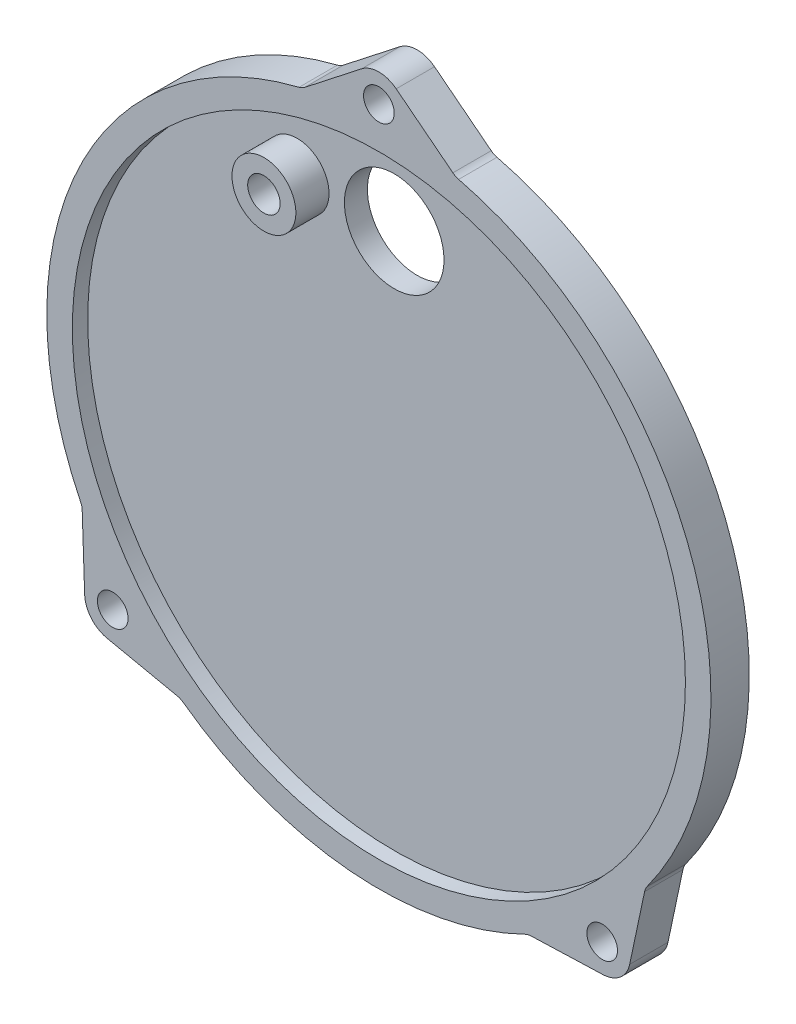
ISO-10303-21;
HEADER;
FILE_DESCRIPTION(('STEP AP214'),'2;1');
FILE_NAME('part.step','',(''),(''),'','','');
FILE_SCHEMA(('AUTOMOTIVE_DESIGN { 1 0 10303 214 1 1 1 1 }'));
ENDSEC;
DATA;
#1=APPLICATION_CONTEXT('core data for automotive mechanical design processes');
#2=APPLICATION_PROTOCOL_DEFINITION('international standard','automotive_design',2000,#1);
#3=PRODUCT_CONTEXT('',#1,'mechanical');
#4=PRODUCT('Part','Part','',(#3));
#5=PRODUCT_RELATED_PRODUCT_CATEGORY('part','',(#4));
#6=PRODUCT_DEFINITION_FORMATION('','',#4);
#7=PRODUCT_DEFINITION_CONTEXT('part definition',#1,'design');
#8=PRODUCT_DEFINITION('design','',#6,#7);
#9=PRODUCT_DEFINITION_SHAPE('','',#8);
#10=(LENGTH_UNIT() NAMED_UNIT(*) SI_UNIT(.MILLI.,.METRE.));
#11=(NAMED_UNIT(*) PLANE_ANGLE_UNIT() SI_UNIT($,.RADIAN.));
#12=(NAMED_UNIT(*) SI_UNIT($,.STERADIAN.) SOLID_ANGLE_UNIT());
#13=UNCERTAINTY_MEASURE_WITH_UNIT(LENGTH_MEASURE(1.E-05),#10,'distance_accuracy_value','');
#14=(GEOMETRIC_REPRESENTATION_CONTEXT(3) GLOBAL_UNCERTAINTY_ASSIGNED_CONTEXT((#13)) GLOBAL_UNIT_ASSIGNED_CONTEXT((#10,
#11,#12)) REPRESENTATION_CONTEXT('',''));
#15=CARTESIAN_POINT('',(0.,0.,0.));
#16=DIRECTION('',(0.,0.,1.));
#17=DIRECTION('',(1.,0.,0.));
#18=AXIS2_PLACEMENT_3D('',#15,#16,#17);
#19=CARTESIAN_POINT('',(0.,0.,4.5));
#20=DIRECTION('',(0.,0.,1.));
#21=DIRECTION('',(1.,0.,0.));
#22=AXIS2_PLACEMENT_3D('',#19,#20,#21);
#23=PLANE('',#22);
#24=CARTESIAN_POINT('',(0.,0.,4.5));
#25=DIRECTION('',(0.,0.,1.));
#26=DIRECTION('',(1.,0.,0.));
#27=AXIS2_PLACEMENT_3D('',#24,#25,#26);
#28=CIRCLE('',#27,60.);
#29=CARTESIAN_POINT('',(60.,0.,4.5));
#30=VERTEX_POINT('',#29);
#31=EDGE_CURVE('E192',#30,#30,#28,.F.);
#32=ORIENTED_EDGE('',*,*,#31,.F.);
#33=EDGE_LOOP('',(#32));
#34=FACE_BOUND('',#33,.T.);
#35=CARTESIAN_POINT('',(0.,45.,4.5));
#36=DIRECTION('',(0.,0.,1.));
#37=DIRECTION('',(1.,0.,0.));
#38=AXIS2_PLACEMENT_3D('',#35,#36,#37);
#39=CIRCLE('',#38,9.75);
#40=CARTESIAN_POINT('',(9.75,45.,4.5));
#41=VERTEX_POINT('',#40);
#42=EDGE_CURVE('E185',#41,#41,#39,.T.);
#43=ORIENTED_EDGE('',*,*,#42,.F.);
#44=EDGE_LOOP('',(#43));
#45=FACE_BOUND('',#44,.T.);
#46=CARTESIAN_POINT('',(-19.,45.,4.5));
#47=DIRECTION('',(0.,0.,1.));
#48=DIRECTION('',(1.,0.,0.));
#49=AXIS2_PLACEMENT_3D('',#46,#47,#48);
#50=CIRCLE('',#49,6.25);
#51=CARTESIAN_POINT('',(-25.25,45.,4.5));
#52=VERTEX_POINT('',#51);
#53=EDGE_CURVE('E645',#52,#52,#50,.T.);
#54=ORIENTED_EDGE('',*,*,#53,.F.);
#55=EDGE_LOOP('',(#54));
#56=FACE_BOUND('',#55,.T.);
#57=ADVANCED_FACE('F32',(#34,#45,#56),#23,.T.);
#58=CARTESIAN_POINT('',(0.,0.,4.5));
#59=DIRECTION('',(0.,0.,-1.));
#60=DIRECTION('',(-1.,0.,0.));
#61=AXIS2_PLACEMENT_3D('',#58,#59,#60);
#62=CYLINDRICAL_SURFACE('',#61,65.);
#63=CARTESIAN_POINT('',(0.,0.,0.));
#64=DIRECTION('',(0.,0.,1.));
#65=DIRECTION('',(1.,0.,0.));
#66=AXIS2_PLACEMENT_3D('',#63,#64,#65);
#67=CIRCLE('',#66,65.);
#68=CARTESIAN_POINT('',(-15.6168346836361,63.0960733680312,0.));
#69=VERTEX_POINT('',#68);
#70=CARTESIAN_POINT('',(-58.372704223372,-28.5941847523361,0.));
#71=VERTEX_POINT('',#70);
#72=EDGE_CURVE('E196',#69,#71,#67,.T.);
#73=ORIENTED_EDGE('',*,*,#72,.T.);
#74=DIRECTION('',(0.,0.,-1.));
#75=VECTOR('',#74,1.);
#76=CARTESIAN_POINT('',(-58.372704223372,-28.5941847523361,4.5));
#77=LINE('',#76,#75);
#78=CARTESIAN_POINT('',(-58.372704223372,-28.5941847523361,7.5));
#79=VERTEX_POINT('',#78);
#80=EDGE_CURVE('E228',#71,#79,#77,.F.);
#81=ORIENTED_EDGE('',*,*,#80,.T.);
#82=CARTESIAN_POINT('',(0.,0.,7.5));
#83=DIRECTION('',(0.,0.,1.));
#84=DIRECTION('',(1.,0.,0.));
#85=AXIS2_PLACEMENT_3D('',#82,#83,#84);
#86=CIRCLE('',#85,65.);
#87=CARTESIAN_POINT('',(-15.6168346836361,63.0960733680312,7.5));
#88=VERTEX_POINT('',#87);
#89=EDGE_CURVE('E166',#88,#79,#86,.T.);
#90=ORIENTED_EDGE('',*,*,#89,.F.);
#91=DIRECTION('',(0.,0.,-1.));
#92=VECTOR('',#91,1.);
#93=CARTESIAN_POINT('',(-15.6168346836361,63.0960733680312,4.5));
#94=LINE('',#93,#92);
#95=EDGE_CURVE('E225',#88,#69,#94,.T.);
#96=ORIENTED_EDGE('',*,*,#95,.T.);
#97=EDGE_LOOP('',(#73,#81,#90,#96));
#98=FACE_BOUND('',#97,.T.);
#99=ADVANCED_FACE('F363',(#98),#62,.T.);
#100=CARTESIAN_POINT('',(-38.2960885490436,-52.5205636093503,0.));
#101=VERTEX_POINT('',#100);
#102=CARTESIAN_POINT('',(28.5941847523363,-58.3727042233719,0.));
#103=VERTEX_POINT('',#102);
#104=EDGE_CURVE('E205',#101,#103,#67,.T.);
#105=ORIENTED_EDGE('',*,*,#104,.T.);
#106=DIRECTION('',(0.,0.,-1.));
#107=VECTOR('',#106,1.);
#108=CARTESIAN_POINT('',(28.5941847523363,-58.3727042233719,4.5));
#109=LINE('',#108,#107);
#110=CARTESIAN_POINT('',(28.5941847523363,-58.3727042233719,7.5));
#111=VERTEX_POINT('',#110);
#112=EDGE_CURVE('E218',#103,#111,#109,.F.);
#113=ORIENTED_EDGE('',*,*,#112,.T.);
#114=CARTESIAN_POINT('',(0.,0.,7.5));
#115=DIRECTION('',(0.,0.,1.));
#116=DIRECTION('',(1.,0.,0.));
#117=AXIS2_PLACEMENT_3D('',#114,#115,#116);
#118=CIRCLE('',#117,65.);
#119=CARTESIAN_POINT('',(-38.2960885490436,-52.5205636093503,7.5));
#120=VERTEX_POINT('',#119);
#121=EDGE_CURVE('E320',#120,#111,#118,.T.);
#122=ORIENTED_EDGE('',*,*,#121,.F.);
#123=DIRECTION('',(0.,0.,-1.));
#124=VECTOR('',#123,1.);
#125=CARTESIAN_POINT('',(-38.2960885490436,-52.5205636093503,4.5));
#126=LINE('',#125,#124);
#127=EDGE_CURVE('E215',#120,#101,#126,.T.);
#128=ORIENTED_EDGE('',*,*,#127,.T.);
#129=EDGE_LOOP('',(#105,#113,#122,#128));
#130=FACE_BOUND('',#129,.T.);
#131=ADVANCED_FACE('F317',(#130),#62,.T.);
#132=CARTESIAN_POINT('',(0.,0.,7.5));
#133=DIRECTION('',(0.,0.,1.));
#134=DIRECTION('',(1.,0.,0.));
#135=AXIS2_PLACEMENT_3D('',#132,#133,#134);
#136=CIRCLE('',#135,65.);
#137=CARTESIAN_POINT('',(52.5205636093505,-38.2960885490434,7.5));
#138=VERTEX_POINT('',#137);
#139=CARTESIAN_POINT('',(15.6168346836361,63.0960733680312,7.5));
#140=VERTEX_POINT('',#139);
#141=EDGE_CURVE('E265',#138,#140,#136,.T.);
#142=ORIENTED_EDGE('',*,*,#141,.F.);
#143=DIRECTION('',(0.,0.,-1.));
#144=VECTOR('',#143,1.);
#145=CARTESIAN_POINT('',(52.5205636093505,-38.2960885490434,4.5));
#146=LINE('',#145,#144);
#147=CARTESIAN_POINT('',(52.5205636093505,-38.2960885490434,0.));
#148=VERTEX_POINT('',#147);
#149=EDGE_CURVE('E207',#138,#148,#146,.T.);
#150=ORIENTED_EDGE('',*,*,#149,.T.);
#151=CARTESIAN_POINT('',(15.6168346836361,63.0960733680312,0.));
#152=VERTEX_POINT('',#151);
#153=EDGE_CURVE('E201',#148,#152,#67,.T.);
#154=ORIENTED_EDGE('',*,*,#153,.T.);
#155=DIRECTION('',(0.,0.,-1.));
#156=VECTOR('',#155,1.);
#157=CARTESIAN_POINT('',(15.6168346836361,63.0960733680312,4.5));
#158=LINE('',#157,#156);
#159=EDGE_CURVE('E195',#152,#140,#158,.F.);
#160=ORIENTED_EDGE('',*,*,#159,.T.);
#161=EDGE_LOOP('',(#142,#150,#154,#160));
#162=FACE_BOUND('',#161,.T.);
#163=ADVANCED_FACE('F260',(#162),#62,.T.);
#164=CARTESIAN_POINT('',(0.,0.,0.));
#165=DIRECTION('',(0.,0.,1.));
#166=DIRECTION('',(1.,0.,0.));
#167=AXIS2_PLACEMENT_3D('',#164,#165,#166);
#168=PLANE('',#167);
#169=CARTESIAN_POINT('',(0.,68.,0.));
#170=DIRECTION('',(0.,0.,1.));
#171=DIRECTION('',(1.,0.,0.));
#172=AXIS2_PLACEMENT_3D('',#169,#170,#171);
#173=CIRCLE('',#172,3.);
#174=CARTESIAN_POINT('',(3.,68.,0.));
#175=VERTEX_POINT('',#174);
#176=EDGE_CURVE('E388',#175,#175,#173,.T.);
#177=ORIENTED_EDGE('',*,*,#176,.T.);
#178=EDGE_LOOP('',(#177));
#179=FACE_BOUND('',#178,.T.);
#180=CARTESIAN_POINT('',(-52.0910221320906,-43.7095574586846,0.));
#181=DIRECTION('',(0.,0.,1.));
#182=DIRECTION('',(1.,0.,0.));
#183=AXIS2_PLACEMENT_3D('',#180,#181,#182);
#184=CIRCLE('',#183,3.);
#185=CARTESIAN_POINT('',(-49.0910221320906,-43.7095574586846,0.));
#186=VERTEX_POINT('',#185);
#187=EDGE_CURVE('E392',#186,#186,#184,.T.);
#188=ORIENTED_EDGE('',*,*,#187,.T.);
#189=EDGE_LOOP('',(#188));
#190=FACE_BOUND('',#189,.T.);
#191=CARTESIAN_POINT('',(43.7095574586848,-52.0910221320905,0.));
#192=DIRECTION('',(0.,0.,1.));
#193=DIRECTION('',(1.,0.,0.));
#194=AXIS2_PLACEMENT_3D('',#191,#192,#193);
#195=CIRCLE('',#194,3.);
#196=CARTESIAN_POINT('',(46.7095574586848,-52.0910221320905,0.));
#197=VERTEX_POINT('',#196);
#198=EDGE_CURVE('E395',#197,#197,#195,.T.);
#199=ORIENTED_EDGE('',*,*,#198,.T.);
#200=EDGE_LOOP('',(#199));
#201=FACE_BOUND('',#200,.T.);
#202=DIRECTION('',(-0.787524786163404,0.616282979789548,0.));
#203=VECTOR('',#202,1.);
#204=CARTESIAN_POINT('',(3.38955638884252,72.3313863238987,0.));
#205=LINE('',#204,#203);
#206=CARTESIAN_POINT('',(14.488762729666,63.6456254726809,0.));
#207=VERTEX_POINT('',#206);
#208=CARTESIAN_POINT('',(3.38955638884252,72.3313863238987,0.));
#209=VERTEX_POINT('',#208);
#210=EDGE_CURVE('E176',#207,#209,#205,.T.);
#211=ORIENTED_EDGE('',*,*,#210,.F.);
#212=CARTESIAN_POINT('',(16.3376116690347,66.0081998311712,0.));
#213=DIRECTION('',(0.,0.,1.));
#214=DIRECTION('',(1.,0.,0.));
#215=AXIS2_PLACEMENT_3D('',#212,#213,#214);
#216=CIRCLE('',#215,3.);
#217=EDGE_CURVE('E40',#207,#152,#216,.T.);
#218=ORIENTED_EDGE('',*,*,#217,.T.);
#219=ORIENTED_EDGE('',*,*,#153,.F.);
#220=CARTESIAN_POINT('',(54.9445896220897,-40.06360032823,0.));
#221=DIRECTION('',(0.,0.,1.));
#222=DIRECTION('',(1.,0.,0.));
#223=AXIS2_PLACEMENT_3D('',#220,#221,#222);
#224=CIRCLE('',#223,3.);
#225=CARTESIAN_POINT('',(52.0096556413194,-39.4421805598614,0.));
#226=VERTEX_POINT('',#225);
#227=EDGE_CURVE('E233',#148,#226,#224,.T.);
#228=ORIENTED_EDGE('',*,*,#227,.T.);
#229=DIRECTION('',(0.207139922789513,0.978311326923467,0.));
#230=VECTOR('',#229,1.);
#231=CARTESIAN_POINT('',(49.0902697567638,-53.2302917074328,0.));
#232=LINE('',#231,#230);
#233=CARTESIAN_POINT('',(49.0902697567638,-53.2302917074328,0.));
#234=VERTEX_POINT('',#233);
#235=EDGE_CURVE('E288',#234,#226,#232,.T.);
#236=ORIENTED_EDGE('',*,*,#235,.F.);
#237=CARTESIAN_POINT('',(43.7095574586848,-52.0910221320905,0.));
#238=DIRECTION('',(0.,0.,1.));
#239=DIRECTION('',(1.,0.,0.));
#240=AXIS2_PLACEMENT_3D('',#237,#238,#239);
#241=CIRCLE('',#240,5.5);
#242=CARTESIAN_POINT('',(43.8971680841413,-57.5878214055964,0.));
#243=VERTEX_POINT('',#242);
#244=EDGE_CURVE('E286',#243,#234,#241,.T.);
#245=ORIENTED_EDGE('',*,*,#244,.F.);
#246=DIRECTION('',(0.999418049728359,0.0341110228102898,0.));
#247=VECTOR('',#246,1.);
#248=CARTESIAN_POINT('',(43.8971680841413,-57.5878214055964,0.));
#249=LINE('',#248,#247);
#250=CARTESIAN_POINT('',(29.8115832878594,-58.0685748844963,0.));
#251=VERTEX_POINT('',#250);
#252=EDGE_CURVE('E284',#251,#243,#249,.T.);
#253=ORIENTED_EDGE('',*,*,#252,.F.);
#254=CARTESIAN_POINT('',(29.9139163562903,-61.0668290336814,0.));
#255=DIRECTION('',(0.,0.,1.));
#256=DIRECTION('',(1.,0.,0.));
#257=AXIS2_PLACEMENT_3D('',#254,#255,#256);
#258=CIRCLE('',#257,3.);
#259=EDGE_CURVE('E237',#251,#103,#258,.T.);
#260=ORIENTED_EDGE('',*,*,#259,.T.);
#261=ORIENTED_EDGE('',*,*,#104,.F.);
#262=CARTESIAN_POINT('',(-40.0636003282302,-54.9445896220896,0.));
#263=DIRECTION('',(0.,0.,1.));
#264=DIRECTION('',(1.,0.,0.));
#265=AXIS2_PLACEMENT_3D('',#262,#263,#264);
#266=CIRCLE('',#265,3.);
#267=CARTESIAN_POINT('',(-39.4421805598616,-52.0096556413192,0.));
#268=VERTEX_POINT('',#267);
#269=EDGE_CURVE('E241',#101,#268,#266,.T.);
#270=ORIENTED_EDGE('',*,*,#269,.T.);
#271=DIRECTION('',(0.978311326923466,-0.207139922789517,0.));
#272=VECTOR('',#271,1.);
#273=CARTESIAN_POINT('',(-53.2302917074329,-49.0902697567636,0.));
#274=LINE('',#273,#272);
#275=CARTESIAN_POINT('',(-53.2302917074329,-49.0902697567636,0.));
#276=VERTEX_POINT('',#275);
#277=EDGE_CURVE('E281',#276,#268,#274,.T.);
#278=ORIENTED_EDGE('',*,*,#277,.F.);
#279=CARTESIAN_POINT('',(-52.0910221320906,-43.7095574586846,0.));
#280=DIRECTION('',(0.,0.,1.));
#281=DIRECTION('',(1.,0.,0.));
#282=AXIS2_PLACEMENT_3D('',#279,#280,#281);
#283=CIRCLE('',#282,5.5);
#284=CARTESIAN_POINT('',(-57.5878214055966,-43.8971680841411,0.));
#285=VERTEX_POINT('',#284);
#286=EDGE_CURVE('E279',#285,#276,#283,.T.);
#287=ORIENTED_EDGE('',*,*,#286,.F.);
#288=DIRECTION('',(0.0341110228102865,-0.999418049728359,0.));
#289=VECTOR('',#288,1.);
#290=CARTESIAN_POINT('',(-57.5878214055966,-43.8971680841411,0.));
#291=LINE('',#290,#289);
#292=CARTESIAN_POINT('',(-58.0685748844964,-29.8115832878592,0.));
#293=VERTEX_POINT('',#292);
#294=EDGE_CURVE('E277',#293,#285,#291,.T.);
#295=ORIENTED_EDGE('',*,*,#294,.F.);
#296=CARTESIAN_POINT('',(-61.0668290336815,-29.9139163562901,0.));
#297=DIRECTION('',(0.,0.,1.));
#298=DIRECTION('',(1.,0.,0.));
#299=AXIS2_PLACEMENT_3D('',#296,#297,#298);
#300=CIRCLE('',#299,3.);
#301=EDGE_CURVE('E245',#293,#71,#300,.T.);
#302=ORIENTED_EDGE('',*,*,#301,.T.);
#303=ORIENTED_EDGE('',*,*,#72,.F.);
#304=CARTESIAN_POINT('',(-16.3376116690347,66.0081998311712,0.));
#305=DIRECTION('',(0.,0.,1.));
#306=DIRECTION('',(1.,0.,0.));
#307=AXIS2_PLACEMENT_3D('',#304,#305,#306);
#308=CIRCLE('',#307,3.);
#309=CARTESIAN_POINT('',(-14.488762729666,63.6456254726809,0.));
#310=VERTEX_POINT('',#309);
#311=EDGE_CURVE('E249',#69,#310,#308,.T.);
#312=ORIENTED_EDGE('',*,*,#311,.T.);
#313=DIRECTION('',(-0.787524786163404,-0.616282979789549,0.));
#314=VECTOR('',#313,1.);
#315=CARTESIAN_POINT('',(-3.38955638884252,72.3313863238987,0.));
#316=LINE('',#315,#314);
#317=CARTESIAN_POINT('',(-3.38955638884252,72.3313863238987,0.));
#318=VERTEX_POINT('',#317);
#319=EDGE_CURVE('E274',#318,#310,#316,.T.);
#320=ORIENTED_EDGE('',*,*,#319,.F.);
#321=CARTESIAN_POINT('',(0.,68.,0.));
#322=DIRECTION('',(0.,0.,1.));
#323=DIRECTION('',(1.,0.,0.));
#324=AXIS2_PLACEMENT_3D('',#321,#322,#323);
#325=CIRCLE('',#324,5.5);
#326=EDGE_CURVE('E180',#209,#318,#325,.T.);
#327=ORIENTED_EDGE('',*,*,#326,.F.);
#328=EDGE_LOOP('',(#211,#218,#219,#228,#236,#245,#253,#260,#261,#270,#278,#287,#295,#302,#303,
#312,#320,#327));
#329=FACE_BOUND('',#328,.T.);
#330=CARTESIAN_POINT('',(-19.,45.,0.));
#331=DIRECTION('',(0.,0.,1.));
#332=DIRECTION('',(1.,0.,0.));
#333=AXIS2_PLACEMENT_3D('',#330,#331,#332);
#334=CIRCLE('',#333,3.175);
#335=CARTESIAN_POINT('',(-15.825,45.,0.));
#336=VERTEX_POINT('',#335);
#337=EDGE_CURVE('E181',#336,#336,#334,.F.);
#338=ORIENTED_EDGE('',*,*,#337,.F.);
#339=EDGE_LOOP('',(#338));
#340=FACE_BOUND('',#339,.T.);
#341=CARTESIAN_POINT('',(0.,45.,0.));
#342=DIRECTION('',(0.,0.,1.));
#343=DIRECTION('',(1.,0.,0.));
#344=AXIS2_PLACEMENT_3D('',#341,#342,#343);
#345=CIRCLE('',#344,9.75);
#346=CARTESIAN_POINT('',(9.75,45.,0.));
#347=VERTEX_POINT('',#346);
#348=EDGE_CURVE('E199',#347,#347,#345,.F.);
#349=ORIENTED_EDGE('',*,*,#348,.F.);
#350=EDGE_LOOP('',(#349));
#351=FACE_BOUND('',#350,.T.);
#352=ADVANCED_FACE('F256',(#179,#190,#201,#329,#340,#351),#168,.F.);
#353=CARTESIAN_POINT('',(-19.,45.,-27.5771644662754));
#354=DIRECTION('',(0.,0.,1.));
#355=DIRECTION('',(1.,0.,0.));
#356=AXIS2_PLACEMENT_3D('',#353,#354,#355);
#357=CYLINDRICAL_SURFACE('',#356,3.175);
#358=ORIENTED_EDGE('',*,*,#337,.T.);
#359=EDGE_LOOP('',(#358));
#360=FACE_BOUND('',#359,.T.);
#361=CARTESIAN_POINT('',(-19.,45.,11.));
#362=DIRECTION('',(0.,0.,1.));
#363=DIRECTION('',(1.,0.,0.));
#364=AXIS2_PLACEMENT_3D('',#361,#362,#363);
#365=CIRCLE('',#364,3.175);
#366=CARTESIAN_POINT('',(-15.825,45.,11.));
#367=VERTEX_POINT('',#366);
#368=EDGE_CURVE('E647',#367,#367,#365,.T.);
#369=ORIENTED_EDGE('',*,*,#368,.T.);
#370=EDGE_LOOP('',(#369));
#371=FACE_BOUND('',#370,.T.);
#372=ADVANCED_FACE('F375',(#360,#371),#357,.F.);
#373=CARTESIAN_POINT('',(0.,45.,-27.5771644662754));
#374=DIRECTION('',(0.,0.,1.));
#375=DIRECTION('',(1.,0.,0.));
#376=AXIS2_PLACEMENT_3D('',#373,#374,#375);
#377=CYLINDRICAL_SURFACE('',#376,9.75);
#378=ORIENTED_EDGE('',*,*,#348,.T.);
#379=EDGE_LOOP('',(#378));
#380=FACE_BOUND('',#379,.T.);
#381=ORIENTED_EDGE('',*,*,#42,.T.);
#382=EDGE_LOOP('',(#381));
#383=FACE_BOUND('',#382,.T.);
#384=ADVANCED_FACE('F383',(#380,#383),#377,.F.);
#385=CARTESIAN_POINT('',(0.,68.,7.5));
#386=DIRECTION('',(0.,0.,1.));
#387=DIRECTION('',(1.,0.,0.));
#388=AXIS2_PLACEMENT_3D('',#385,#386,#387);
#389=PLANE('',#388);
#390=CARTESIAN_POINT('',(43.7095574586848,-52.0910221320905,7.5));
#391=DIRECTION('',(0.,0.,1.));
#392=DIRECTION('',(1.,0.,0.));
#393=AXIS2_PLACEMENT_3D('',#390,#391,#392);
#394=CIRCLE('',#393,3.);
#395=CARTESIAN_POINT('',(46.7095574586848,-52.0910221320905,7.5));
#396=VERTEX_POINT('',#395);
#397=EDGE_CURVE('E397',#396,#396,#394,.T.);
#398=ORIENTED_EDGE('',*,*,#397,.F.);
#399=EDGE_LOOP('',(#398));
#400=FACE_BOUND('',#399,.T.);
#401=CARTESIAN_POINT('',(0.,0.,7.5));
#402=DIRECTION('',(0.,0.,1.));
#403=DIRECTION('',(1.,0.,0.));
#404=AXIS2_PLACEMENT_3D('',#401,#402,#403);
#405=CIRCLE('',#404,60.);
#406=CARTESIAN_POINT('',(60.,0.,7.5));
#407=VERTEX_POINT('',#406);
#408=EDGE_CURVE('E275',#407,#407,#405,.T.);
#409=ORIENTED_EDGE('',*,*,#408,.F.);
#410=EDGE_LOOP('',(#409));
#411=FACE_BOUND('',#410,.T.);
#412=CARTESIAN_POINT('',(0.,68.,7.5));
#413=DIRECTION('',(0.,0.,1.));
#414=DIRECTION('',(1.,0.,0.));
#415=AXIS2_PLACEMENT_3D('',#412,#413,#414);
#416=CIRCLE('',#415,5.5);
#417=CARTESIAN_POINT('',(3.38955638884252,72.3313863238987,7.5));
#418=VERTEX_POINT('',#417);
#419=CARTESIAN_POINT('',(-3.38955638884252,72.3313863238987,7.5));
#420=VERTEX_POINT('',#419);
#421=EDGE_CURVE('E167',#418,#420,#416,.T.);
#422=ORIENTED_EDGE('',*,*,#421,.T.);
#423=DIRECTION('',(-0.787524786163404,-0.616282979789549,0.));
#424=VECTOR('',#423,1.);
#425=CARTESIAN_POINT('',(-3.38955638884252,72.3313863238987,7.5));
#426=LINE('',#425,#424);
#427=CARTESIAN_POINT('',(-14.488762729666,63.6456254726809,7.5));
#428=VERTEX_POINT('',#427);
#429=EDGE_CURVE('E156',#420,#428,#426,.T.);
#430=ORIENTED_EDGE('',*,*,#429,.T.);
#431=CARTESIAN_POINT('',(-16.3376116690347,66.0081998311712,7.5));
#432=DIRECTION('',(0.,0.,1.));
#433=DIRECTION('',(1.,0.,0.));
#434=AXIS2_PLACEMENT_3D('',#431,#432,#433);
#435=CIRCLE('',#434,3.);
#436=EDGE_CURVE('E251',#428,#88,#435,.F.);
#437=ORIENTED_EDGE('',*,*,#436,.T.);
#438=ORIENTED_EDGE('',*,*,#89,.T.);
#439=CARTESIAN_POINT('',(-61.0668290336815,-29.9139163562901,7.5));
#440=DIRECTION('',(0.,0.,1.));
#441=DIRECTION('',(1.,0.,0.));
#442=AXIS2_PLACEMENT_3D('',#439,#440,#441);
#443=CIRCLE('',#442,3.);
#444=CARTESIAN_POINT('',(-58.0685748844964,-29.8115832878592,7.5));
#445=VERTEX_POINT('',#444);
#446=EDGE_CURVE('E247',#79,#445,#443,.F.);
#447=ORIENTED_EDGE('',*,*,#446,.T.);
#448=DIRECTION('',(0.0341110228102865,-0.999418049728359,0.));
#449=VECTOR('',#448,1.);
#450=CARTESIAN_POINT('',(-57.5878214055966,-43.8971680841411,7.5));
#451=LINE('',#450,#449);
#452=CARTESIAN_POINT('',(-57.5878214055966,-43.8971680841411,7.5));
#453=VERTEX_POINT('',#452);
#454=EDGE_CURVE('E414',#445,#453,#451,.T.);
#455=ORIENTED_EDGE('',*,*,#454,.T.);
#456=CARTESIAN_POINT('',(-52.0910221320906,-43.7095574586846,7.5));
#457=DIRECTION('',(0.,0.,1.));
#458=DIRECTION('',(1.,0.,0.));
#459=AXIS2_PLACEMENT_3D('',#456,#457,#458);
#460=CIRCLE('',#459,5.5);
#461=CARTESIAN_POINT('',(-53.2302917074329,-49.0902697567636,7.5));
#462=VERTEX_POINT('',#461);
#463=EDGE_CURVE('E326',#453,#462,#460,.T.);
#464=ORIENTED_EDGE('',*,*,#463,.T.);
#465=DIRECTION('',(0.978311326923466,-0.207139922789517,0.));
#466=VECTOR('',#465,1.);
#467=CARTESIAN_POINT('',(-53.2302917074329,-49.0902697567636,7.5));
#468=LINE('',#467,#466);
#469=CARTESIAN_POINT('',(-39.4421805598616,-52.0096556413192,7.5));
#470=VERTEX_POINT('',#469);
#471=EDGE_CURVE('E304',#462,#470,#468,.T.);
#472=ORIENTED_EDGE('',*,*,#471,.T.);
#473=CARTESIAN_POINT('',(-40.0636003282302,-54.9445896220896,7.5));
#474=DIRECTION('',(0.,0.,1.));
#475=DIRECTION('',(1.,0.,0.));
#476=AXIS2_PLACEMENT_3D('',#473,#474,#475);
#477=CIRCLE('',#476,3.);
#478=EDGE_CURVE('E243',#470,#120,#477,.F.);
#479=ORIENTED_EDGE('',*,*,#478,.T.);
#480=ORIENTED_EDGE('',*,*,#121,.T.);
#481=CARTESIAN_POINT('',(29.9139163562903,-61.0668290336814,7.5));
#482=DIRECTION('',(0.,0.,1.));
#483=DIRECTION('',(1.,0.,0.));
#484=AXIS2_PLACEMENT_3D('',#481,#482,#483);
#485=CIRCLE('',#484,3.);
#486=CARTESIAN_POINT('',(29.8115832878594,-58.0685748844963,7.5));
#487=VERTEX_POINT('',#486);
#488=EDGE_CURVE('E239',#111,#487,#485,.F.);
#489=ORIENTED_EDGE('',*,*,#488,.T.);
#490=DIRECTION('',(0.999418049728359,0.0341110228102898,0.));
#491=VECTOR('',#490,1.);
#492=CARTESIAN_POINT('',(43.8971680841413,-57.5878214055964,7.5));
#493=LINE('',#492,#491);
#494=CARTESIAN_POINT('',(43.8971680841413,-57.5878214055964,7.5));
#495=VERTEX_POINT('',#494);
#496=EDGE_CURVE('E322',#487,#495,#493,.T.);
#497=ORIENTED_EDGE('',*,*,#496,.T.);
#498=CARTESIAN_POINT('',(43.7095574586848,-52.0910221320905,7.5));
#499=DIRECTION('',(0.,0.,1.));
#500=DIRECTION('',(1.,0.,0.));
#501=AXIS2_PLACEMENT_3D('',#498,#499,#500);
#502=CIRCLE('',#501,5.5);
#503=CARTESIAN_POINT('',(49.0902697567638,-53.2302917074328,7.5));
#504=VERTEX_POINT('',#503);
#505=EDGE_CURVE('E324',#495,#504,#502,.T.);
#506=ORIENTED_EDGE('',*,*,#505,.T.);
#507=DIRECTION('',(0.207139922789513,0.978311326923467,0.));
#508=VECTOR('',#507,1.);
#509=CARTESIAN_POINT('',(49.0902697567638,-53.2302917074328,7.5));
#510=LINE('',#509,#508);
#511=CARTESIAN_POINT('',(52.0096556413194,-39.4421805598614,7.5));
#512=VERTEX_POINT('',#511);
#513=EDGE_CURVE('E269',#504,#512,#510,.T.);
#514=ORIENTED_EDGE('',*,*,#513,.T.);
#515=CARTESIAN_POINT('',(54.9445896220897,-40.06360032823,7.5));
#516=DIRECTION('',(0.,0.,1.));
#517=DIRECTION('',(1.,0.,0.));
#518=AXIS2_PLACEMENT_3D('',#515,#516,#517);
#519=CIRCLE('',#518,3.);
#520=EDGE_CURVE('E235',#512,#138,#519,.F.);
#521=ORIENTED_EDGE('',*,*,#520,.T.);
#522=ORIENTED_EDGE('',*,*,#141,.T.);
#523=CARTESIAN_POINT('',(16.3376116690347,66.0081998311712,7.5));
#524=DIRECTION('',(0.,0.,1.));
#525=DIRECTION('',(1.,0.,0.));
#526=AXIS2_PLACEMENT_3D('',#523,#524,#525);
#527=CIRCLE('',#526,3.);
#528=CARTESIAN_POINT('',(14.488762729666,63.6456254726809,7.5));
#529=VERTEX_POINT('',#528);
#530=EDGE_CURVE('E11',#140,#529,#527,.F.);
#531=ORIENTED_EDGE('',*,*,#530,.T.);
#532=DIRECTION('',(-0.787524786163404,0.616282979789548,0.));
#533=VECTOR('',#532,1.);
#534=CARTESIAN_POINT('',(3.38955638884252,72.3313863238987,7.5));
#535=LINE('',#534,#533);
#536=EDGE_CURVE('E172',#529,#418,#535,.T.);
#537=ORIENTED_EDGE('',*,*,#536,.T.);
#538=EDGE_LOOP('',(#422,#430,#437,#438,#447,#455,#464,#472,#479,#480,#489,#497,#506,#514,#521,
#522,#531,#537));
#539=FACE_BOUND('',#538,.T.);
#540=CARTESIAN_POINT('',(-52.0910221320906,-43.7095574586846,7.5));
#541=DIRECTION('',(0.,0.,1.));
#542=DIRECTION('',(1.,0.,0.));
#543=AXIS2_PLACEMENT_3D('',#540,#541,#542);
#544=CIRCLE('',#543,3.);
#545=CARTESIAN_POINT('',(-49.0910221320906,-43.7095574586846,7.5));
#546=VERTEX_POINT('',#545);
#547=EDGE_CURVE('E406',#546,#546,#544,.T.);
#548=ORIENTED_EDGE('',*,*,#547,.F.);
#549=EDGE_LOOP('',(#548));
#550=FACE_BOUND('',#549,.T.);
#551=CARTESIAN_POINT('',(0.,68.,7.5));
#552=DIRECTION('',(0.,0.,1.));
#553=DIRECTION('',(1.,0.,0.));
#554=AXIS2_PLACEMENT_3D('',#551,#552,#553);
#555=CIRCLE('',#554,3.);
#556=CARTESIAN_POINT('',(3.,68.,7.5));
#557=VERTEX_POINT('',#556);
#558=EDGE_CURVE('E398',#557,#557,#555,.T.);
#559=ORIENTED_EDGE('',*,*,#558,.F.);
#560=EDGE_LOOP('',(#559));
#561=FACE_BOUND('',#560,.T.);
#562=ADVANCED_FACE('F170',(#400,#411,#539,#550,#561),#389,.T.);
#563=CARTESIAN_POINT('',(0.,68.,7.5));
#564=DIRECTION('',(0.,0.,-1.));
#565=DIRECTION('',(-1.,0.,0.));
#566=AXIS2_PLACEMENT_3D('',#563,#564,#565);
#567=CYLINDRICAL_SURFACE('',#566,5.5);
#568=ORIENTED_EDGE('',*,*,#326,.T.);
#569=DIRECTION('',(0.,0.,-1.));
#570=VECTOR('',#569,1.);
#571=CARTESIAN_POINT('',(-3.38955638884252,72.3313863238987,7.5));
#572=LINE('',#571,#570);
#573=EDGE_CURVE('E161',#420,#318,#572,.T.);
#574=ORIENTED_EDGE('',*,*,#573,.F.);
#575=ORIENTED_EDGE('',*,*,#421,.F.);
#576=DIRECTION('',(0.,0.,-1.));
#577=VECTOR('',#576,1.);
#578=CARTESIAN_POINT('',(3.38955638884252,72.3313863238987,7.5));
#579=LINE('',#578,#577);
#580=EDGE_CURVE('E264',#418,#209,#579,.T.);
#581=ORIENTED_EDGE('',*,*,#580,.T.);
#582=EDGE_LOOP('',(#568,#574,#575,#581));
#583=FACE_BOUND('',#582,.T.);
#584=ADVANCED_FACE('F178',(#583),#567,.T.);
#585=CARTESIAN_POINT('',(-3.38955638884252,72.3313863238987,7.5));
#586=DIRECTION('',(0.616282979789548,-0.787524786163404,0.));
#587=DIRECTION('',(0.787524786163404,0.616282979789548,0.));
#588=AXIS2_PLACEMENT_3D('',#585,#586,#587);
#589=PLANE('',#588);
#590=ORIENTED_EDGE('',*,*,#319,.T.);
#591=DIRECTION('',(0.,0.,1.));
#592=VECTOR('',#591,1.);
#593=CARTESIAN_POINT('',(-14.488762729666,63.6456254726809,7.5));
#594=LINE('',#593,#592);
#595=EDGE_CURVE('E164',#310,#428,#594,.T.);
#596=ORIENTED_EDGE('',*,*,#595,.T.);
#597=ORIENTED_EDGE('',*,*,#429,.F.);
#598=ORIENTED_EDGE('',*,*,#573,.T.);
#599=EDGE_LOOP('',(#590,#596,#597,#598));
#600=FACE_BOUND('',#599,.T.);
#601=ADVANCED_FACE('F159',(#600),#589,.F.);
#602=CARTESIAN_POINT('',(-57.5878214055966,-43.8971680841411,7.5));
#603=DIRECTION('',(0.999418049728359,0.0341110228102865,0.));
#604=DIRECTION('',(-0.0341110228102866,0.999418049728359,0.));
#605=AXIS2_PLACEMENT_3D('',#602,#603,#604);
#606=PLANE('',#605);
#607=ORIENTED_EDGE('',*,*,#454,.F.);
#608=DIRECTION('',(0.,0.,1.));
#609=VECTOR('',#608,1.);
#610=CARTESIAN_POINT('',(-58.0685748844964,-29.8115832878592,0.));
#611=LINE('',#610,#609);
#612=EDGE_CURVE('E222',#445,#293,#611,.F.);
#613=ORIENTED_EDGE('',*,*,#612,.T.);
#614=ORIENTED_EDGE('',*,*,#294,.T.);
#615=DIRECTION('',(0.,0.,-1.));
#616=VECTOR('',#615,1.);
#617=CARTESIAN_POINT('',(-57.5878214055966,-43.8971680841411,7.5));
#618=LINE('',#617,#616);
#619=EDGE_CURVE('E182',#453,#285,#618,.T.);
#620=ORIENTED_EDGE('',*,*,#619,.F.);
#621=EDGE_LOOP('',(#607,#613,#614,#620));
#622=FACE_BOUND('',#621,.T.);
#623=ADVANCED_FACE('F419',(#622),#606,.F.);
#624=CARTESIAN_POINT('',(-52.0910221320906,-43.7095574586846,7.5));
#625=DIRECTION('',(0.,0.,-1.));
#626=DIRECTION('',(-1.,0.,0.));
#627=AXIS2_PLACEMENT_3D('',#624,#625,#626);
#628=CYLINDRICAL_SURFACE('',#627,5.5);
#629=ORIENTED_EDGE('',*,*,#286,.T.);
#630=DIRECTION('',(0.,0.,-1.));
#631=VECTOR('',#630,1.);
#632=CARTESIAN_POINT('',(-53.2302917074329,-49.0902697567636,7.5));
#633=LINE('',#632,#631);
#634=EDGE_CURVE('E188',#462,#276,#633,.T.);
#635=ORIENTED_EDGE('',*,*,#634,.F.);
#636=ORIENTED_EDGE('',*,*,#463,.F.);
#637=ORIENTED_EDGE('',*,*,#619,.T.);
#638=EDGE_LOOP('',(#629,#635,#636,#637));
#639=FACE_BOUND('',#638,.T.);
#640=ADVANCED_FACE('F417',(#639),#628,.T.);
#641=CARTESIAN_POINT('',(-53.2302917074329,-49.0902697567636,7.5));
#642=DIRECTION('',(0.207139922789517,0.978311326923466,0.));
#643=DIRECTION('',(-0.978311326923466,0.207139922789517,0.));
#644=AXIS2_PLACEMENT_3D('',#641,#642,#643);
#645=PLANE('',#644);
#646=ORIENTED_EDGE('',*,*,#277,.T.);
#647=DIRECTION('',(0.,0.,1.));
#648=VECTOR('',#647,1.);
#649=CARTESIAN_POINT('',(-39.4421805598616,-52.0096556413192,7.5));
#650=LINE('',#649,#648);
#651=EDGE_CURVE('E220',#268,#470,#650,.T.);
#652=ORIENTED_EDGE('',*,*,#651,.T.);
#653=ORIENTED_EDGE('',*,*,#471,.F.);
#654=ORIENTED_EDGE('',*,*,#634,.T.);
#655=EDGE_LOOP('',(#646,#652,#653,#654));
#656=FACE_BOUND('',#655,.T.);
#657=ADVANCED_FACE('F301',(#656),#645,.F.);
#658=CARTESIAN_POINT('',(43.8971680841413,-57.5878214055964,7.5));
#659=DIRECTION('',(-0.0341110228102899,0.999418049728359,0.));
#660=DIRECTION('',(-0.999418049728359,-0.0341110228102899,0.));
#661=AXIS2_PLACEMENT_3D('',#658,#659,#660);
#662=PLANE('',#661);
#663=ORIENTED_EDGE('',*,*,#496,.F.);
#664=DIRECTION('',(0.,0.,1.));
#665=VECTOR('',#664,1.);
#666=CARTESIAN_POINT('',(29.8115832878594,-58.0685748844963,0.));
#667=LINE('',#666,#665);
#668=EDGE_CURVE('E212',#487,#251,#667,.F.);
#669=ORIENTED_EDGE('',*,*,#668,.T.);
#670=ORIENTED_EDGE('',*,*,#252,.T.);
#671=DIRECTION('',(0.,0.,-1.));
#672=VECTOR('',#671,1.);
#673=CARTESIAN_POINT('',(43.8971680841413,-57.5878214055964,7.5));
#674=LINE('',#673,#672);
#675=EDGE_CURVE('E294',#495,#243,#674,.T.);
#676=ORIENTED_EDGE('',*,*,#675,.F.);
#677=EDGE_LOOP('',(#663,#669,#670,#676));
#678=FACE_BOUND('',#677,.T.);
#679=ADVANCED_FACE('F348',(#678),#662,.F.);
#680=CARTESIAN_POINT('',(43.7095574586848,-52.0910221320905,7.5));
#681=DIRECTION('',(0.,0.,-1.));
#682=DIRECTION('',(-1.,0.,0.));
#683=AXIS2_PLACEMENT_3D('',#680,#681,#682);
#684=CYLINDRICAL_SURFACE('',#683,5.5);
#685=ORIENTED_EDGE('',*,*,#244,.T.);
#686=DIRECTION('',(0.,0.,-1.));
#687=VECTOR('',#686,1.);
#688=CARTESIAN_POINT('',(49.0902697567638,-53.2302917074328,7.5));
#689=LINE('',#688,#687);
#690=EDGE_CURVE('E267',#504,#234,#689,.T.);
#691=ORIENTED_EDGE('',*,*,#690,.F.);
#692=ORIENTED_EDGE('',*,*,#505,.F.);
#693=ORIENTED_EDGE('',*,*,#675,.T.);
#694=EDGE_LOOP('',(#685,#691,#692,#693));
#695=FACE_BOUND('',#694,.T.);
#696=ADVANCED_FACE('F343',(#695),#684,.T.);
#697=CARTESIAN_POINT('',(49.0902697567638,-53.2302917074328,7.5));
#698=DIRECTION('',(-0.978311326923467,0.207139922789513,0.));
#699=DIRECTION('',(-0.207139922789513,-0.978311326923467,0.));
#700=AXIS2_PLACEMENT_3D('',#697,#698,#699);
#701=PLANE('',#700);
#702=ORIENTED_EDGE('',*,*,#235,.T.);
#703=DIRECTION('',(0.,0.,1.));
#704=VECTOR('',#703,1.);
#705=CARTESIAN_POINT('',(52.0096556413194,-39.4421805598614,7.5));
#706=LINE('',#705,#704);
#707=EDGE_CURVE('E210',#226,#512,#706,.T.);
#708=ORIENTED_EDGE('',*,*,#707,.T.);
#709=ORIENTED_EDGE('',*,*,#513,.F.);
#710=ORIENTED_EDGE('',*,*,#690,.T.);
#711=EDGE_LOOP('',(#702,#708,#709,#710));
#712=FACE_BOUND('',#711,.T.);
#713=ADVANCED_FACE('F341',(#712),#701,.F.);
#714=CARTESIAN_POINT('',(3.38955638884252,72.3313863238987,7.5));
#715=DIRECTION('',(-0.616282979789549,-0.787524786163404,0.));
#716=DIRECTION('',(0.787524786163404,-0.616282979789549,0.));
#717=AXIS2_PLACEMENT_3D('',#714,#715,#716);
#718=PLANE('',#717);
#719=ORIENTED_EDGE('',*,*,#536,.F.);
#720=DIRECTION('',(0.,0.,1.));
#721=VECTOR('',#720,1.);
#722=CARTESIAN_POINT('',(14.488762729666,63.6456254726809,0.));
#723=LINE('',#722,#721);
#724=EDGE_CURVE('E231',#529,#207,#723,.F.);
#725=ORIENTED_EDGE('',*,*,#724,.T.);
#726=ORIENTED_EDGE('',*,*,#210,.T.);
#727=ORIENTED_EDGE('',*,*,#580,.F.);
#728=EDGE_LOOP('',(#719,#725,#726,#727));
#729=FACE_BOUND('',#728,.T.);
#730=ADVANCED_FACE('F263',(#729),#718,.F.);
#731=CARTESIAN_POINT('',(0.,0.,7.5));
#732=DIRECTION('',(0.,0.,-1.));
#733=DIRECTION('',(-1.,0.,0.));
#734=AXIS2_PLACEMENT_3D('',#731,#732,#733);
#735=CYLINDRICAL_SURFACE('',#734,60.);
#736=ORIENTED_EDGE('',*,*,#31,.T.);
#737=EDGE_LOOP('',(#736));
#738=FACE_BOUND('',#737,.T.);
#739=ORIENTED_EDGE('',*,*,#408,.T.);
#740=EDGE_LOOP('',(#739));
#741=FACE_BOUND('',#740,.T.);
#742=ADVANCED_FACE('F463',(#738,#741),#735,.F.);
#743=CARTESIAN_POINT('',(-52.0910221320906,-43.7095574586846,7.5));
#744=DIRECTION('',(0.,0.,-1.));
#745=DIRECTION('',(-1.,0.,0.));
#746=AXIS2_PLACEMENT_3D('',#743,#744,#745);
#747=CYLINDRICAL_SURFACE('',#746,3.);
#748=ORIENTED_EDGE('',*,*,#187,.F.);
#749=EDGE_LOOP('',(#748));
#750=FACE_BOUND('',#749,.T.);
#751=ORIENTED_EDGE('',*,*,#547,.T.);
#752=EDGE_LOOP('',(#751));
#753=FACE_BOUND('',#752,.T.);
#754=ADVANCED_FACE('F565',(#750,#753),#747,.F.);
#755=CARTESIAN_POINT('',(43.7095574586848,-52.0910221320905,7.5));
#756=DIRECTION('',(0.,0.,-1.));
#757=DIRECTION('',(-1.,0.,0.));
#758=AXIS2_PLACEMENT_3D('',#755,#756,#757);
#759=CYLINDRICAL_SURFACE('',#758,3.);
#760=ORIENTED_EDGE('',*,*,#198,.F.);
#761=EDGE_LOOP('',(#760));
#762=FACE_BOUND('',#761,.T.);
#763=ORIENTED_EDGE('',*,*,#397,.T.);
#764=EDGE_LOOP('',(#763));
#765=FACE_BOUND('',#764,.T.);
#766=ADVANCED_FACE('F555',(#762,#765),#759,.F.);
#767=CARTESIAN_POINT('',(0.,68.,7.5));
#768=DIRECTION('',(0.,0.,-1.));
#769=DIRECTION('',(-1.,0.,0.));
#770=AXIS2_PLACEMENT_3D('',#767,#768,#769);
#771=CYLINDRICAL_SURFACE('',#770,3.);
#772=ORIENTED_EDGE('',*,*,#176,.F.);
#773=EDGE_LOOP('',(#772));
#774=FACE_BOUND('',#773,.T.);
#775=ORIENTED_EDGE('',*,*,#558,.T.);
#776=EDGE_LOOP('',(#775));
#777=FACE_BOUND('',#776,.T.);
#778=ADVANCED_FACE('F360',(#774,#777),#771,.F.);
#779=CARTESIAN_POINT('',(54.9445896220897,-40.06360032823,4.5));
#780=DIRECTION('',(0.,0.,-1.));
#781=DIRECTION('',(-1.,0.,0.));
#782=AXIS2_PLACEMENT_3D('',#779,#780,#781);
#783=CYLINDRICAL_SURFACE('',#782,3.);
#784=ORIENTED_EDGE('',*,*,#520,.F.);
#785=ORIENTED_EDGE('',*,*,#707,.F.);
#786=ORIENTED_EDGE('',*,*,#227,.F.);
#787=ORIENTED_EDGE('',*,*,#149,.F.);
#788=EDGE_LOOP('',(#784,#785,#786,#787));
#789=FACE_BOUND('',#788,.T.);
#790=ADVANCED_FACE('F338',(#789),#783,.F.);
#791=CARTESIAN_POINT('',(29.9139163562903,-61.0668290336814,4.5));
#792=DIRECTION('',(0.,0.,-1.));
#793=DIRECTION('',(-1.,0.,0.));
#794=AXIS2_PLACEMENT_3D('',#791,#792,#793);
#795=CYLINDRICAL_SURFACE('',#794,3.);
#796=ORIENTED_EDGE('',*,*,#488,.F.);
#797=ORIENTED_EDGE('',*,*,#112,.F.);
#798=ORIENTED_EDGE('',*,*,#259,.F.);
#799=ORIENTED_EDGE('',*,*,#668,.F.);
#800=EDGE_LOOP('',(#796,#797,#798,#799));
#801=FACE_BOUND('',#800,.T.);
#802=ADVANCED_FACE('F351',(#801),#795,.F.);
#803=CARTESIAN_POINT('',(-40.0636003282302,-54.9445896220896,4.5));
#804=DIRECTION('',(0.,0.,-1.));
#805=DIRECTION('',(-1.,0.,0.));
#806=AXIS2_PLACEMENT_3D('',#803,#804,#805);
#807=CYLINDRICAL_SURFACE('',#806,3.);
#808=ORIENTED_EDGE('',*,*,#478,.F.);
#809=ORIENTED_EDGE('',*,*,#651,.F.);
#810=ORIENTED_EDGE('',*,*,#269,.F.);
#811=ORIENTED_EDGE('',*,*,#127,.F.);
#812=EDGE_LOOP('',(#808,#809,#810,#811));
#813=FACE_BOUND('',#812,.T.);
#814=ADVANCED_FACE('F314',(#813),#807,.F.);
#815=CARTESIAN_POINT('',(-61.0668290336815,-29.9139163562901,4.5));
#816=DIRECTION('',(0.,0.,-1.));
#817=DIRECTION('',(-1.,0.,0.));
#818=AXIS2_PLACEMENT_3D('',#815,#816,#817);
#819=CYLINDRICAL_SURFACE('',#818,3.);
#820=ORIENTED_EDGE('',*,*,#446,.F.);
#821=ORIENTED_EDGE('',*,*,#80,.F.);
#822=ORIENTED_EDGE('',*,*,#301,.F.);
#823=ORIENTED_EDGE('',*,*,#612,.F.);
#824=EDGE_LOOP('',(#820,#821,#822,#823));
#825=FACE_BOUND('',#824,.T.);
#826=ADVANCED_FACE('F358',(#825),#819,.F.);
#827=CARTESIAN_POINT('',(-16.3376116690347,66.0081998311712,4.5));
#828=DIRECTION('',(0.,0.,-1.));
#829=DIRECTION('',(-1.,0.,0.));
#830=AXIS2_PLACEMENT_3D('',#827,#828,#829);
#831=CYLINDRICAL_SURFACE('',#830,3.);
#832=ORIENTED_EDGE('',*,*,#436,.F.);
#833=ORIENTED_EDGE('',*,*,#595,.F.);
#834=ORIENTED_EDGE('',*,*,#311,.F.);
#835=ORIENTED_EDGE('',*,*,#95,.F.);
#836=EDGE_LOOP('',(#832,#833,#834,#835));
#837=FACE_BOUND('',#836,.T.);
#838=ADVANCED_FACE('F428',(#837),#831,.F.);
#839=CARTESIAN_POINT('',(16.3376116690347,66.0081998311712,4.5));
#840=DIRECTION('',(0.,0.,-1.));
#841=DIRECTION('',(-1.,0.,0.));
#842=AXIS2_PLACEMENT_3D('',#839,#840,#841);
#843=CYLINDRICAL_SURFACE('',#842,3.);
#844=ORIENTED_EDGE('',*,*,#530,.F.);
#845=ORIENTED_EDGE('',*,*,#159,.F.);
#846=ORIENTED_EDGE('',*,*,#217,.F.);
#847=ORIENTED_EDGE('',*,*,#724,.F.);
#848=EDGE_LOOP('',(#844,#845,#846,#847));
#849=FACE_BOUND('',#848,.T.);
#850=ADVANCED_FACE('F34',(#849),#843,.F.);
#851=CARTESIAN_POINT('',(-19.,45.,11.));
#852=DIRECTION('',(0.,0.,1.));
#853=DIRECTION('',(1.,0.,0.));
#854=AXIS2_PLACEMENT_3D('',#851,#852,#853);
#855=PLANE('',#854);
#856=CARTESIAN_POINT('',(-19.,45.,11.));
#857=DIRECTION('',(0.,0.,1.));
#858=DIRECTION('',(1.,0.,0.));
#859=AXIS2_PLACEMENT_3D('',#856,#857,#858);
#860=CIRCLE('',#859,6.25);
#861=CARTESIAN_POINT('',(-25.25,45.,11.));
#862=VERTEX_POINT('',#861);
#863=EDGE_CURVE('E642',#862,#862,#860,.T.);
#864=ORIENTED_EDGE('',*,*,#863,.T.);
#865=EDGE_LOOP('',(#864));
#866=FACE_BOUND('',#865,.T.);
#867=ORIENTED_EDGE('',*,*,#368,.F.);
#868=EDGE_LOOP('',(#867));
#869=FACE_BOUND('',#868,.T.);
#870=ADVANCED_FACE('F434',(#866,#869),#855,.T.);
#871=CARTESIAN_POINT('',(-19.,45.,11.));
#872=DIRECTION('',(0.,0.,-1.));
#873=DIRECTION('',(-1.,0.,0.));
#874=AXIS2_PLACEMENT_3D('',#871,#872,#873);
#875=CYLINDRICAL_SURFACE('',#874,6.25);
#876=CARTESIAN_POINT('',(-25.25,45.,11.));
#877=CARTESIAN_POINT('',(-25.25,45.,10.9322916666667));
#878=CARTESIAN_POINT('',(-25.25,45.,10.8645833333333));
#879=CARTESIAN_POINT('',(-25.25,45.,10.7291666666667));
#880=CARTESIAN_POINT('',(-25.25,45.,10.6614583333333));
#881=CARTESIAN_POINT('',(-25.25,45.,10.5260416666667));
#882=CARTESIAN_POINT('',(-25.25,45.,10.4583333333333));
#883=CARTESIAN_POINT('',(-25.25,45.,10.3229166666667));
#884=CARTESIAN_POINT('',(-25.25,45.,10.2552083333333));
#885=CARTESIAN_POINT('',(-25.25,45.,10.1197916666667));
#886=CARTESIAN_POINT('',(-25.25,45.,10.0520833333333));
#887=CARTESIAN_POINT('',(-25.25,45.,9.91666666666667));
#888=CARTESIAN_POINT('',(-25.25,45.,9.84895833333333));
#889=CARTESIAN_POINT('',(-25.25,45.,9.71354166666667));
#890=CARTESIAN_POINT('',(-25.25,45.,9.64583333333333));
#891=CARTESIAN_POINT('',(-25.25,45.,9.51041666666667));
#892=CARTESIAN_POINT('',(-25.25,45.,9.44270833333333));
#893=CARTESIAN_POINT('',(-25.25,45.,9.30729166666666));
#894=CARTESIAN_POINT('',(-25.25,45.,9.23958333333333));
#895=CARTESIAN_POINT('',(-25.25,45.,9.10416666666667));
#896=CARTESIAN_POINT('',(-25.25,45.,9.03645833333333));
#897=CARTESIAN_POINT('',(-25.25,45.,8.90104166666667));
#898=CARTESIAN_POINT('',(-25.25,45.,8.83333333333333));
#899=CARTESIAN_POINT('',(-25.25,45.,8.69791666666667));
#900=CARTESIAN_POINT('',(-25.25,45.,8.63020833333333));
#901=CARTESIAN_POINT('',(-25.25,45.,8.49479166666667));
#902=CARTESIAN_POINT('',(-25.25,45.,8.42708333333333));
#903=CARTESIAN_POINT('',(-25.25,45.,8.29166666666667));
#904=CARTESIAN_POINT('',(-25.25,45.,8.22395833333333));
#905=CARTESIAN_POINT('',(-25.25,45.,8.08854166666667));
#906=CARTESIAN_POINT('',(-25.25,45.,8.02083333333333));
#907=CARTESIAN_POINT('',(-25.25,45.,7.88541666666667));
#908=CARTESIAN_POINT('',(-25.25,45.,7.81770833333333));
#909=CARTESIAN_POINT('',(-25.25,45.,7.68229166666667));
#910=CARTESIAN_POINT('',(-25.25,45.,7.61458333333333));
#911=CARTESIAN_POINT('',(-25.25,45.,7.47916666666667));
#912=CARTESIAN_POINT('',(-25.25,45.,7.41145833333333));
#913=CARTESIAN_POINT('',(-25.25,45.,7.27604166666667));
#914=CARTESIAN_POINT('',(-25.25,45.,7.20833333333333));
#915=CARTESIAN_POINT('',(-25.25,45.,7.07291666666667));
#916=CARTESIAN_POINT('',(-25.25,45.,7.00520833333333));
#917=CARTESIAN_POINT('',(-25.25,45.,6.86979166666667));
#918=CARTESIAN_POINT('',(-25.25,45.,6.80208333333333));
#919=CARTESIAN_POINT('',(-25.25,45.,6.66666666666667));
#920=CARTESIAN_POINT('',(-25.25,45.,6.59895833333333));
#921=CARTESIAN_POINT('',(-25.25,45.,6.46354166666667));
#922=CARTESIAN_POINT('',(-25.25,45.,6.39583333333333));
#923=CARTESIAN_POINT('',(-25.25,45.,6.26041666666667));
#924=CARTESIAN_POINT('',(-25.25,45.,6.19270833333333));
#925=CARTESIAN_POINT('',(-25.25,45.,6.05729166666667));
#926=CARTESIAN_POINT('',(-25.25,45.,5.98958333333333));
#927=CARTESIAN_POINT('',(-25.25,45.,5.85416666666667));
#928=CARTESIAN_POINT('',(-25.25,45.,5.78645833333333));
#929=CARTESIAN_POINT('',(-25.25,45.,5.65104166666667));
#930=CARTESIAN_POINT('',(-25.25,45.,5.58333333333333));
#931=CARTESIAN_POINT('',(-25.25,45.,5.44791666666667));
#932=CARTESIAN_POINT('',(-25.25,45.,5.38020833333333));
#933=CARTESIAN_POINT('',(-25.25,45.,5.24479166666667));
#934=CARTESIAN_POINT('',(-25.25,45.,5.17708333333333));
#935=CARTESIAN_POINT('',(-25.25,45.,5.04166666666667));
#936=CARTESIAN_POINT('',(-25.25,45.,4.97395833333333));
#937=CARTESIAN_POINT('',(-25.25,45.,4.83854166666667));
#938=CARTESIAN_POINT('',(-25.25,45.,4.77083333333333));
#939=CARTESIAN_POINT('',(-25.25,45.,4.63541666666667));
#940=CARTESIAN_POINT('',(-25.25,45.,4.56770833333333));
#941=CARTESIAN_POINT('',(-25.25,45.,4.5));
#942=B_SPLINE_CURVE_WITH_KNOTS('',3,(#876,#877,#878,#879,#880,#881,#882,#883,#884,#885,#886,
#887,#888,#889,#890,#891,#892,#893,#894,#895,#896,#897,#898,#899,#900,#901,#902,#903,#904,#905,
#906,#907,#908,#909,#910,#911,#912,#913,#914,#915,#916,#917,#918,#919,#920,#921,#922,#923,#924,
#925,#926,#927,#928,#929,#930,#931,#932,#933,#934,#935,#936,#937,#938,#939,#940,#941),
.UNSPECIFIED.,.F.,.F.,(4,2,2,2,2,2,2,2,2,2,2,2,2,2,2,2,2,2,2,2,2,2,2,2,2,2,2,2,2,2,2,2,4),(0.,
0.203125,0.40625,0.609375000000001,0.812500000000001,1.015625,1.21875,1.421875,1.625,1.828125,
2.03125,2.234375,2.4375,2.640625,2.84375,3.046875,3.25,3.453125,3.65625,3.859375,4.0625,
4.265625,4.46875,4.671875,4.875,5.078125,5.28125,5.484375,5.6875,5.890625,6.09375,6.296875,6.5),.UNSPECIFIED.);
#943=EDGE_CURVE('BSEAM625',#862,#52,#942,.T.);
#944=ORIENTED_EDGE('',*,*,#863,.F.);
#945=ORIENTED_EDGE('',*,*,#53,.T.);
#946=ORIENTED_EDGE('',*,*,#943,.T.);
#947=ORIENTED_EDGE('',*,*,#943,.F.);
#948=EDGE_LOOP('',(#944,#946,#945,#947));
#949=FACE_BOUND('',#948,.T.);
#950=ADVANCED_FACE('F625',(#949),#875,.T.);
#951=CLOSED_SHELL('',(#57,#99,#131,#163,#352,#372,#384,#562,#584,#601,#623,#640,#657,#679,#696,
#713,#730,#742,#754,#766,#778,#790,#802,#814,#826,#838,#850,#870,#950));
#952=MANIFOLD_SOLID_BREP('B2',#951);
#953=ADVANCED_BREP_SHAPE_REPRESENTATION('',(#18,#952),#14);
#954=SHAPE_DEFINITION_REPRESENTATION(#9,#953);
ENDSEC;
END-ISO-10303-21;
